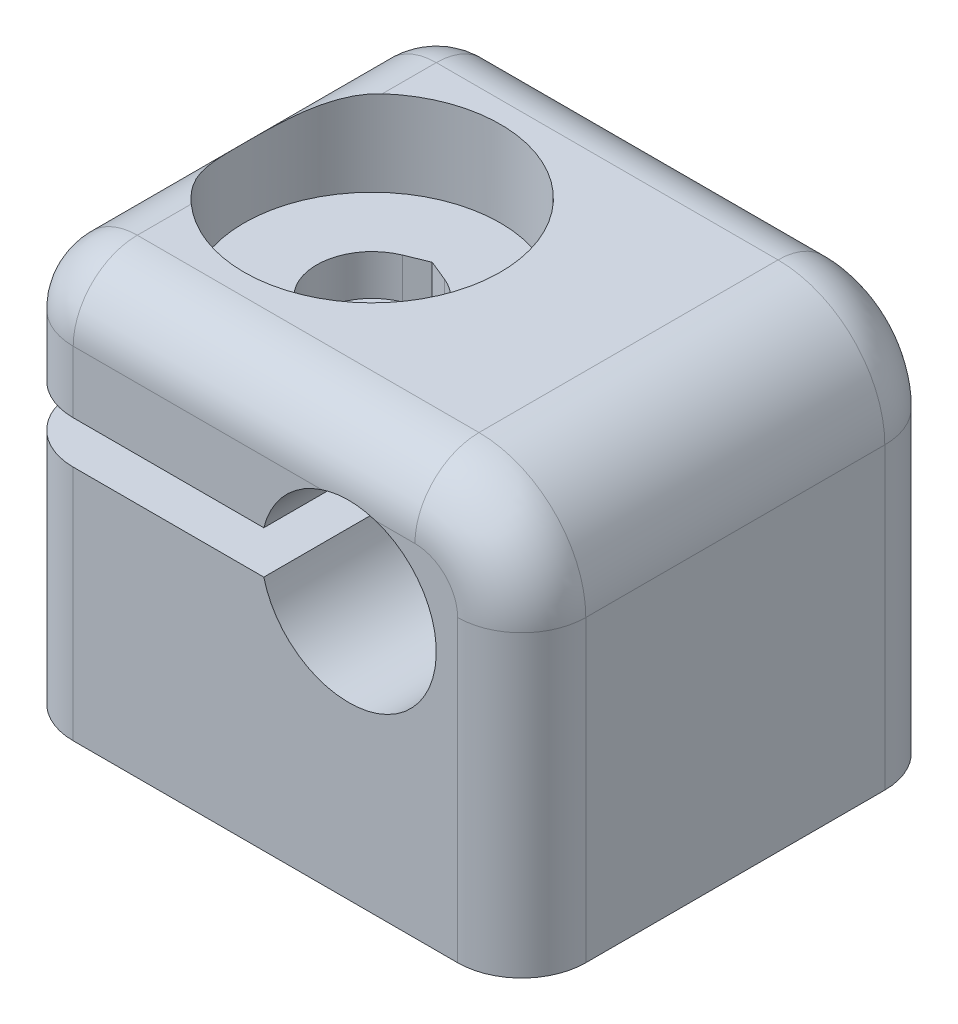
ISO-10303-21;
HEADER;
FILE_DESCRIPTION(('STEP AP214'),'2;1');
FILE_NAME('part.step','',(''),(''),'','','');
FILE_SCHEMA(('AUTOMOTIVE_DESIGN { 1 0 10303 214 1 1 1 1 }'));
ENDSEC;
DATA;
#1=APPLICATION_CONTEXT('core data for automotive mechanical design processes');
#2=APPLICATION_PROTOCOL_DEFINITION('international standard','automotive_design',2000,#1);
#3=PRODUCT_CONTEXT('',#1,'mechanical');
#4=PRODUCT('Part','Part','',(#3));
#5=PRODUCT_RELATED_PRODUCT_CATEGORY('part','',(#4));
#6=PRODUCT_DEFINITION_FORMATION('','',#4);
#7=PRODUCT_DEFINITION_CONTEXT('part definition',#1,'design');
#8=PRODUCT_DEFINITION('design','',#6,#7);
#9=PRODUCT_DEFINITION_SHAPE('','',#8);
#10=(LENGTH_UNIT() NAMED_UNIT(*) SI_UNIT(.MILLI.,.METRE.));
#11=(NAMED_UNIT(*) PLANE_ANGLE_UNIT() SI_UNIT($,.RADIAN.));
#12=(NAMED_UNIT(*) SI_UNIT($,.STERADIAN.) SOLID_ANGLE_UNIT());
#13=UNCERTAINTY_MEASURE_WITH_UNIT(LENGTH_MEASURE(1.E-05),#10,'distance_accuracy_value','');
#14=(GEOMETRIC_REPRESENTATION_CONTEXT(3) GLOBAL_UNCERTAINTY_ASSIGNED_CONTEXT((#13)) GLOBAL_UNIT_ASSIGNED_CONTEXT((#10,
#11,#12)) REPRESENTATION_CONTEXT('',''));
#15=CARTESIAN_POINT('',(0.,0.,0.));
#16=DIRECTION('',(0.,0.,1.));
#17=DIRECTION('',(1.,0.,0.));
#18=AXIS2_PLACEMENT_3D('',#15,#16,#17);
#19=CARTESIAN_POINT('',(7.,0.,10.));
#20=DIRECTION('',(0.,1.,0.));
#21=DIRECTION('',(0.,0.,1.));
#22=AXIS2_PLACEMENT_3D('',#19,#20,#21);
#23=CYLINDRICAL_SURFACE('',#22,2.6);
#24=DIRECTION('',(0.,1.,0.));
#25=VECTOR('',#24,1.);
#26=CARTESIAN_POINT('',(6.01509273831689,0.,7.59376690948614));
#27=LINE('',#26,#25);
#28=CARTESIAN_POINT('',(6.01509273831689,13.1,7.59376690948614));
#29=VERTEX_POINT('',#28);
#30=CARTESIAN_POINT('',(6.01509273831689,15.,7.59376690948614));
#31=VERTEX_POINT('',#30);
#32=EDGE_CURVE('E223',#29,#31,#27,.T.);
#33=ORIENTED_EDGE('',*,*,#32,.T.);
#34=CARTESIAN_POINT('',(7.,15.,10.));
#35=DIRECTION('',(0.,1.,0.));
#36=DIRECTION('',(0.,0.,1.));
#37=AXIS2_PLACEMENT_3D('',#34,#35,#36);
#38=CIRCLE('',#37,2.6);
#39=CARTESIAN_POINT('',(7.98490726168311,15.,7.59376690948614));
#40=VERTEX_POINT('',#39);
#41=EDGE_CURVE('E267',#31,#40,#38,.T.);
#42=ORIENTED_EDGE('',*,*,#41,.T.);
#43=DIRECTION('',(0.,1.,0.));
#44=VECTOR('',#43,1.);
#45=CARTESIAN_POINT('',(7.98490726168311,0.,7.59376690948614));
#46=LINE('',#45,#44);
#47=CARTESIAN_POINT('',(7.98490726168311,13.1,7.59376690948614));
#48=VERTEX_POINT('',#47);
#49=EDGE_CURVE('E67',#48,#40,#46,.T.);
#50=ORIENTED_EDGE('',*,*,#49,.F.);
#51=CARTESIAN_POINT('',(7.,13.1,10.));
#52=DIRECTION('',(0.,1.,0.));
#53=DIRECTION('',(0.,0.,1.));
#54=AXIS2_PLACEMENT_3D('',#51,#52,#53);
#55=CIRCLE('',#54,2.6);
#56=EDGE_CURVE('E282',#29,#48,#55,.T.);
#57=ORIENTED_EDGE('',*,*,#56,.F.);
#58=EDGE_LOOP('',(#33,#42,#50,#57));
#59=FACE_BOUND('',#58,.T.);
#60=ADVANCED_FACE('F41',(#59),#23,.F.);
#61=CARTESIAN_POINT('',(6.01509273831689,0.,7.59376690948614));
#62=VERTEX_POINT('',#61);
#63=CARTESIAN_POINT('',(6.01509273831689,11.1,7.59376690948614));
#64=VERTEX_POINT('',#63);
#65=EDGE_CURVE('E230',#62,#64,#27,.T.);
#66=ORIENTED_EDGE('',*,*,#65,.T.);
#67=CARTESIAN_POINT('',(7.,11.1,10.));
#68=DIRECTION('',(0.,1.,0.));
#69=DIRECTION('',(0.,0.,1.));
#70=AXIS2_PLACEMENT_3D('',#67,#68,#69);
#71=CIRCLE('',#70,2.6);
#72=CARTESIAN_POINT('',(7.98490726168311,11.1,7.59376690948614));
#73=VERTEX_POINT('',#72);
#74=EDGE_CURVE('E283',#64,#73,#71,.T.);
#75=ORIENTED_EDGE('',*,*,#74,.T.);
#76=CARTESIAN_POINT('',(7.98490726168311,0.,7.59376690948614));
#77=VERTEX_POINT('',#76);
#78=EDGE_CURVE('E251',#77,#73,#46,.T.);
#79=ORIENTED_EDGE('',*,*,#78,.F.);
#80=CARTESIAN_POINT('',(7.,0.,10.));
#81=DIRECTION('',(0.,1.,0.));
#82=DIRECTION('',(0.,0.,1.));
#83=AXIS2_PLACEMENT_3D('',#80,#81,#82);
#84=CIRCLE('',#83,2.6);
#85=EDGE_CURVE('E238',#62,#77,#84,.T.);
#86=ORIENTED_EDGE('',*,*,#85,.F.);
#87=EDGE_LOOP('',(#66,#75,#79,#86));
#88=FACE_BOUND('',#87,.T.);
#89=ADVANCED_FACE('F524',(#88),#23,.F.);
#90=CARTESIAN_POINT('',(0.,0.,0.));
#91=DIRECTION('',(0.,0.,1.));
#92=DIRECTION('',(1.,0.,0.));
#93=AXIS2_PLACEMENT_3D('',#90,#91,#92);
#94=PLANE('',#93);
#95=DIRECTION('',(1.,0.,0.));
#96=VECTOR('',#95,1.);
#97=CARTESIAN_POINT('',(0.,13.1,0.));
#98=LINE('',#97,#96);
#99=CARTESIAN_POINT('',(3.,13.1,0.));
#100=VERTEX_POINT('',#99);
#101=CARTESIAN_POINT('',(11.9238209295858,13.1,0.));
#102=VERTEX_POINT('',#101);
#103=EDGE_CURVE('E316',#100,#102,#98,.T.);
#104=ORIENTED_EDGE('',*,*,#103,.F.);
#105=DIRECTION('',(0.,1.,0.));
#106=VECTOR('',#105,1.);
#107=CARTESIAN_POINT('',(3.,19.,0.));
#108=LINE('',#107,#106);
#109=CARTESIAN_POINT('',(3.,16.,0.));
#110=VERTEX_POINT('',#109);
#111=EDGE_CURVE('E410',#100,#110,#108,.T.);
#112=ORIENTED_EDGE('',*,*,#111,.T.);
#113=DIRECTION('',(1.,0.,0.));
#114=VECTOR('',#113,1.);
#115=CARTESIAN_POINT('',(19.,16.,0.));
#116=LINE('',#115,#114);
#117=CARTESIAN_POINT('',(14.6350889359327,16.,0.));
#118=VERTEX_POINT('',#117);
#119=EDGE_CURVE('E407',#110,#118,#116,.T.);
#120=ORIENTED_EDGE('',*,*,#119,.T.);
#121=CARTESIAN_POINT('',(15.9,12.1,0.));
#122=DIRECTION('',(0.,0.,1.));
#123=DIRECTION('',(1.,0.,0.));
#124=AXIS2_PLACEMENT_3D('',#121,#122,#123);
#125=CIRCLE('',#124,4.1);
#126=EDGE_CURVE('E287',#118,#102,#125,.T.);
#127=ORIENTED_EDGE('',*,*,#126,.T.);
#128=EDGE_LOOP('',(#104,#112,#120,#127));
#129=FACE_BOUND('',#128,.T.);
#130=ADVANCED_FACE('F536',(#129),#94,.F.);
#131=CARTESIAN_POINT('',(0.,0.,20.));
#132=DIRECTION('',(0.,0.,1.));
#133=DIRECTION('',(1.,0.,0.));
#134=AXIS2_PLACEMENT_3D('',#131,#132,#133);
#135=PLANE('',#134);
#136=DIRECTION('',(1.,0.,0.));
#137=VECTOR('',#136,1.);
#138=CARTESIAN_POINT('',(0.,11.1,20.));
#139=LINE('',#138,#137);
#140=CARTESIAN_POINT('',(3.,11.1,20.));
#141=VERTEX_POINT('',#140);
#142=CARTESIAN_POINT('',(11.9238209295858,11.1,20.));
#143=VERTEX_POINT('',#142);
#144=EDGE_CURVE('E292',#141,#143,#139,.T.);
#145=ORIENTED_EDGE('',*,*,#144,.F.);
#146=DIRECTION('',(0.,1.,0.));
#147=VECTOR('',#146,1.);
#148=CARTESIAN_POINT('',(3.,0.,20.));
#149=LINE('',#148,#147);
#150=CARTESIAN_POINT('',(3.,0.,20.));
#151=VERTEX_POINT('',#150);
#152=EDGE_CURVE('E370',#141,#151,#149,.F.);
#153=ORIENTED_EDGE('',*,*,#152,.T.);
#154=DIRECTION('',(1.,0.,0.));
#155=VECTOR('',#154,1.);
#156=CARTESIAN_POINT('',(0.,0.,20.));
#157=LINE('',#156,#155);
#158=CARTESIAN_POINT('',(21.,0.,20.));
#159=VERTEX_POINT('',#158);
#160=EDGE_CURVE('E296',#151,#159,#157,.T.);
#161=ORIENTED_EDGE('',*,*,#160,.T.);
#162=DIRECTION('',(0.,1.,0.));
#163=VECTOR('',#162,1.);
#164=CARTESIAN_POINT('',(21.,14.,20.));
#165=LINE('',#164,#163);
#166=CARTESIAN_POINT('',(21.,14.,20.));
#167=VERTEX_POINT('',#166);
#168=EDGE_CURVE('E366',#159,#167,#165,.T.);
#169=ORIENTED_EDGE('',*,*,#168,.T.);
#170=CARTESIAN_POINT('',(19.,14.,20.));
#171=DIRECTION('',(0.,0.,1.));
#172=DIRECTION('',(1.,0.,0.));
#173=AXIS2_PLACEMENT_3D('',#170,#171,#172);
#174=CIRCLE('',#173,2.);
#175=CARTESIAN_POINT('',(19.,16.,20.));
#176=VERTEX_POINT('',#175);
#177=EDGE_CURVE('E363',#167,#176,#174,.T.);
#178=ORIENTED_EDGE('',*,*,#177,.T.);
#179=DIRECTION('',(1.,0.,0.));
#180=VECTOR('',#179,1.);
#181=CARTESIAN_POINT('',(0.,16.,20.));
#182=LINE('',#181,#180);
#183=CARTESIAN_POINT('',(17.1649110640674,16.,20.));
#184=VERTEX_POINT('',#183);
#185=EDGE_CURVE('E360',#176,#184,#182,.F.);
#186=ORIENTED_EDGE('',*,*,#185,.T.);
#187=CARTESIAN_POINT('',(15.9,12.1,20.));
#188=DIRECTION('',(0.,0.,1.));
#189=DIRECTION('',(1.,0.,0.));
#190=AXIS2_PLACEMENT_3D('',#187,#188,#189);
#191=CIRCLE('',#190,4.1);
#192=EDGE_CURVE('E288',#143,#184,#191,.T.);
#193=ORIENTED_EDGE('',*,*,#192,.F.);
#194=EDGE_LOOP('',(#145,#153,#161,#169,#178,#186,#193));
#195=FACE_BOUND('',#194,.T.);
#196=ADVANCED_FACE('F532',(#195),#135,.T.);
#197=CARTESIAN_POINT('',(15.9,12.1,20.));
#198=DIRECTION('',(0.,0.,-1.));
#199=DIRECTION('',(-1.,0.,0.));
#200=AXIS2_PLACEMENT_3D('',#197,#198,#199);
#201=CYLINDRICAL_SURFACE('',#200,4.1);
#202=ORIENTED_EDGE('',*,*,#192,.T.);
#203=CARTESIAN_POINT('',(17.1649110640674,16.,20.));
#204=CARTESIAN_POINT('',(17.1031638951836,16.0200268082445,19.9999968937395));
#205=CARTESIAN_POINT('',(17.0409511802578,16.0385836985973,19.9997999076769));
#206=CARTESIAN_POINT('',(16.9157170485939,16.0727235353958,19.9991675618007));
#207=CARTESIAN_POINT('',(16.8526956427364,16.0883065218094,19.998732205191));
#208=CARTESIAN_POINT('',(16.6626075978802,16.1305424047058,19.9972927029825));
#209=CARTESIAN_POINT('',(16.5345091687764,16.1526848060147,19.9961550862282));
#210=CARTESIAN_POINT('',(16.280470281121,16.1842575048887,19.9943766202452));
#211=CARTESIAN_POINT('',(16.1545720687806,16.1940314443266,19.9937225623678));
#212=CARTESIAN_POINT('',(15.9024737937324,16.2019387495765,19.9931971492077));
#213=CARTESIAN_POINT('',(15.7762738675293,16.2000766430753,19.9933254894865));
#214=CARTESIAN_POINT('',(15.4797321163529,16.1819805998517,19.994500651046));
#215=CARTESIAN_POINT('',(15.3096538552461,16.1608708567261,19.9958578965448));
#216=CARTESIAN_POINT('',(15.0559652346775,16.1131321524609,19.9979059068658));
#217=CARTESIAN_POINT('',(14.9708115893245,16.09427285349,19.9985974536958));
#218=CARTESIAN_POINT('',(14.8018579551513,16.0511617615015,19.9996396847393));
#219=CARTESIAN_POINT('',(14.7180582774393,16.0269087475245,19.9999902916786));
#220=CARTESIAN_POINT('',(14.6350889359327,16.,20.));
#221=B_SPLINE_CURVE_WITH_KNOTS('',3,(#203,#204,#205,#206,#207,#208,#209,#210,#211,#212,#213,
#214,#215,#216,#217,#218,#219,#220),.UNSPECIFIED.,.F.,.F.,(4,2,2,2,2,2,2,2,4),(0.,
0.194701616706055,0.389400616529195,0.778773606233934,1.1570721766778,1.53522355702222,
2.0478643918967,2.30937389821554,2.57094266203364),.UNSPECIFIED.);
#222=CARTESIAN_POINT('',(14.6350889359327,16.,20.));
#223=VERTEX_POINT('',#222);
#224=EDGE_CURVE('E460',#184,#223,#221,.T.);
#225=ORIENTED_EDGE('',*,*,#224,.T.);
#226=CARTESIAN_POINT('',(11.9238209295858,13.1,20.));
#227=VERTEX_POINT('',#226);
#228=EDGE_CURVE('E293',#223,#227,#191,.T.);
#229=ORIENTED_EDGE('',*,*,#228,.T.);
#230=DIRECTION('',(0.,0.,-1.));
#231=VECTOR('',#230,1.);
#232=CARTESIAN_POINT('',(11.9238209295858,13.1,20.));
#233=LINE('',#232,#231);
#234=EDGE_CURVE('E304',#227,#102,#233,.T.);
#235=ORIENTED_EDGE('',*,*,#234,.T.);
#236=ORIENTED_EDGE('',*,*,#126,.F.);
#237=CARTESIAN_POINT('',(14.6350889359327,16.,0.));
#238=CARTESIAN_POINT('',(14.6968361048164,16.0200268082445,3.10626050887969E-06));
#239=CARTESIAN_POINT('',(14.7590488197422,16.0385836985973,0.000200092323089053));
#240=CARTESIAN_POINT('',(14.8842829514061,16.0727235353958,0.000832438199301096));
#241=CARTESIAN_POINT('',(14.9473043572636,16.0883065218094,0.00126779480904008));
#242=CARTESIAN_POINT('',(15.1373924021198,16.1305424047058,0.00270729701751907));
#243=CARTESIAN_POINT('',(15.2654908312236,16.1526848060147,0.00384491377183081));
#244=CARTESIAN_POINT('',(15.519529718879,16.1842575048887,0.00562337975484948));
#245=CARTESIAN_POINT('',(15.6454279312194,16.1940314443266,0.00627743763217685));
#246=CARTESIAN_POINT('',(15.8975262062676,16.2019387495765,0.00680285079230982));
#247=CARTESIAN_POINT('',(16.0237261324707,16.2000766430753,0.00667451051352525));
#248=CARTESIAN_POINT('',(16.3202678836471,16.1819805998517,0.00549934895396518));
#249=CARTESIAN_POINT('',(16.4903461447539,16.1608708567261,0.00414210345523295));
#250=CARTESIAN_POINT('',(16.7440347653225,16.1131321524609,0.00209409313415694));
#251=CARTESIAN_POINT('',(16.8291884106755,16.09427285349,0.00140254630419275));
#252=CARTESIAN_POINT('',(16.9981420448487,16.0511617615015,0.000360315260662845));
#253=CARTESIAN_POINT('',(17.0819417225608,16.0269087475245,9.70832135134175E-06));
#254=CARTESIAN_POINT('',(17.1649110640674,16.,0.));
#255=B_SPLINE_CURVE_WITH_KNOTS('',3,(#237,#238,#239,#240,#241,#242,#243,#244,#245,#246,#247,
#248,#249,#250,#251,#252,#253,#254),.UNSPECIFIED.,.F.,.F.,(4,2,2,2,2,2,2,2,4),(0.,
0.194701616706055,0.389400616529195,0.778773606233936,1.1570721766778,1.53522355702222,
2.0478643918967,2.30937389821554,2.57094266203364),.UNSPECIFIED.);
#256=CARTESIAN_POINT('',(17.1649110640674,16.,0.));
#257=VERTEX_POINT('',#256);
#258=EDGE_CURVE('E451',#118,#257,#255,.T.);
#259=ORIENTED_EDGE('',*,*,#258,.T.);
#260=CARTESIAN_POINT('',(11.9238209295858,11.1,0.));
#261=VERTEX_POINT('',#260);
#262=EDGE_CURVE('E305',#261,#257,#125,.T.);
#263=ORIENTED_EDGE('',*,*,#262,.F.);
#264=DIRECTION('',(0.,0.,-1.));
#265=VECTOR('',#264,1.);
#266=CARTESIAN_POINT('',(11.9238209295858,11.1,20.));
#267=LINE('',#266,#265);
#268=EDGE_CURVE('E338',#143,#261,#267,.T.);
#269=ORIENTED_EDGE('',*,*,#268,.F.);
#270=EDGE_LOOP('',(#202,#225,#229,#235,#236,#259,#263,#269));
#271=FACE_BOUND('',#270,.T.);
#272=ADVANCED_FACE('F467',(#271),#201,.F.);
#273=CARTESIAN_POINT('',(0.,11.1,20.));
#274=DIRECTION('',(0.,1.,0.));
#275=DIRECTION('',(0.,0.,1.));
#276=AXIS2_PLACEMENT_3D('',#273,#274,#275);
#277=PLANE('',#276);
#278=DIRECTION('',(-0.925474265582254,0.,0.378810485262734));
#279=VECTOR('',#278,1.);
#280=CARTESIAN_POINT('',(-3.48621913190205,11.1,11.4827962364397));
#281=LINE('',#280,#279);
#282=CARTESIAN_POINT('',(7.,11.1,7.19062960830765));
#283=VERTEX_POINT('',#282);
#284=EDGE_CURVE('E263',#283,#64,#281,.T.);
#285=ORIENTED_EDGE('',*,*,#284,.F.);
#286=DIRECTION('',(-0.925474265582254,0.,-0.378810485262733));
#287=VECTOR('',#286,1.);
#288=CARTESIAN_POINT('',(5.49518250433187,11.1,6.57468525743231));
#289=LINE('',#288,#287);
#290=EDGE_CURVE('E219',#73,#283,#289,.T.);
#291=ORIENTED_EDGE('',*,*,#290,.F.);
#292=ORIENTED_EDGE('',*,*,#74,.F.);
#293=EDGE_LOOP('',(#285,#291,#292));
#294=FACE_BOUND('',#293,.T.);
#295=DIRECTION('',(0.,0.,-1.));
#296=VECTOR('',#295,1.);
#297=CARTESIAN_POINT('',(0.,11.1,20.));
#298=LINE('',#297,#296);
#299=CARTESIAN_POINT('',(0.,11.1,17.));
#300=VERTEX_POINT('',#299);
#301=CARTESIAN_POINT('',(0.,11.1,3.));
#302=VERTEX_POINT('',#301);
#303=EDGE_CURVE('E334',#300,#302,#298,.T.);
#304=ORIENTED_EDGE('',*,*,#303,.F.);
#305=CARTESIAN_POINT('',(3.,11.1,17.));
#306=DIRECTION('',(0.,1.,0.));
#307=DIRECTION('',(0.,0.,1.));
#308=AXIS2_PLACEMENT_3D('',#305,#306,#307);
#309=CIRCLE('',#308,3.);
#310=EDGE_CURVE('E428',#300,#141,#309,.T.);
#311=ORIENTED_EDGE('',*,*,#310,.T.);
#312=ORIENTED_EDGE('',*,*,#144,.T.);
#313=ORIENTED_EDGE('',*,*,#268,.T.);
#314=DIRECTION('',(1.,0.,0.));
#315=VECTOR('',#314,1.);
#316=CARTESIAN_POINT('',(0.,11.1,0.));
#317=LINE('',#316,#315);
#318=CARTESIAN_POINT('',(3.,11.1,0.));
#319=VERTEX_POINT('',#318);
#320=EDGE_CURVE('E309',#319,#261,#317,.T.);
#321=ORIENTED_EDGE('',*,*,#320,.F.);
#322=CARTESIAN_POINT('',(3.,11.1,3.));
#323=DIRECTION('',(0.,1.,0.));
#324=DIRECTION('',(0.,0.,1.));
#325=AXIS2_PLACEMENT_3D('',#322,#323,#324);
#326=CIRCLE('',#325,3.);
#327=EDGE_CURVE('E425',#319,#302,#326,.T.);
#328=ORIENTED_EDGE('',*,*,#327,.T.);
#329=EDGE_LOOP('',(#304,#311,#312,#313,#321,#328));
#330=FACE_BOUND('',#329,.T.);
#331=ADVANCED_FACE('F554',(#294,#330),#277,.T.);
#332=CARTESIAN_POINT('',(0.,0.,20.));
#333=DIRECTION('',(-1.,0.,0.));
#334=DIRECTION('',(0.,0.,1.));
#335=AXIS2_PLACEMENT_3D('',#332,#333,#334);
#336=PLANE('',#335);
#337=DIRECTION('',(0.,0.,-1.));
#338=VECTOR('',#337,1.);
#339=CARTESIAN_POINT('',(0.,0.,20.));
#340=LINE('',#339,#338);
#341=CARTESIAN_POINT('',(0.,0.,17.));
#342=VERTEX_POINT('',#341);
#343=CARTESIAN_POINT('',(0.,0.,3.));
#344=VERTEX_POINT('',#343);
#345=EDGE_CURVE('E330',#342,#344,#340,.T.);
#346=ORIENTED_EDGE('',*,*,#345,.F.);
#347=DIRECTION('',(0.,1.,0.));
#348=VECTOR('',#347,1.);
#349=CARTESIAN_POINT('',(0.,0.,17.));
#350=LINE('',#349,#348);
#351=EDGE_CURVE('E421',#342,#300,#350,.T.);
#352=ORIENTED_EDGE('',*,*,#351,.T.);
#353=ORIENTED_EDGE('',*,*,#303,.T.);
#354=DIRECTION('',(0.,1.,0.));
#355=VECTOR('',#354,1.);
#356=CARTESIAN_POINT('',(0.,0.,3.));
#357=LINE('',#356,#355);
#358=EDGE_CURVE('E418',#302,#344,#357,.F.);
#359=ORIENTED_EDGE('',*,*,#358,.T.);
#360=EDGE_LOOP('',(#346,#352,#353,#359));
#361=FACE_BOUND('',#360,.T.);
#362=ADVANCED_FACE('F545',(#361),#336,.T.);
#363=CARTESIAN_POINT('',(0.,0.,20.));
#364=DIRECTION('',(0.,1.,0.));
#365=DIRECTION('',(0.,0.,1.));
#366=AXIS2_PLACEMENT_3D('',#363,#364,#365);
#367=PLANE('',#366);
#368=DIRECTION('',(-0.925474265582254,0.,-0.378810485262733));
#369=VECTOR('',#368,1.);
#370=CARTESIAN_POINT('',(7.98490726168311,0.,7.59376690948614));
#371=LINE('',#370,#369);
#372=CARTESIAN_POINT('',(7.,0.,7.19062960830765));
#373=VERTEX_POINT('',#372);
#374=EDGE_CURVE('E59',#77,#373,#371,.T.);
#375=ORIENTED_EDGE('',*,*,#374,.T.);
#376=DIRECTION('',(-0.925474265582254,0.,0.378810485262734));
#377=VECTOR('',#376,1.);
#378=CARTESIAN_POINT('',(7.,0.,7.19062960830765));
#379=LINE('',#378,#377);
#380=EDGE_CURVE('E227',#373,#62,#379,.T.);
#381=ORIENTED_EDGE('',*,*,#380,.T.);
#382=ORIENTED_EDGE('',*,*,#85,.T.);
#383=EDGE_LOOP('',(#375,#381,#382));
#384=FACE_BOUND('',#383,.T.);
#385=DIRECTION('',(0.,0.,-1.));
#386=VECTOR('',#385,1.);
#387=CARTESIAN_POINT('',(24.,0.,20.));
#388=LINE('',#387,#386);
#389=CARTESIAN_POINT('',(24.,0.,17.));
#390=VERTEX_POINT('',#389);
#391=CARTESIAN_POINT('',(24.,0.,3.));
#392=VERTEX_POINT('',#391);
#393=EDGE_CURVE('E326',#390,#392,#388,.T.);
#394=ORIENTED_EDGE('',*,*,#393,.F.);
#395=CARTESIAN_POINT('',(21.,0.,17.));
#396=DIRECTION('',(0.,1.,0.));
#397=DIRECTION('',(0.,0.,1.));
#398=AXIS2_PLACEMENT_3D('',#395,#396,#397);
#399=CIRCLE('',#398,3.);
#400=EDGE_CURVE('E389',#390,#159,#399,.F.);
#401=ORIENTED_EDGE('',*,*,#400,.T.);
#402=ORIENTED_EDGE('',*,*,#160,.F.);
#403=CARTESIAN_POINT('',(3.,0.,17.));
#404=DIRECTION('',(0.,1.,0.));
#405=DIRECTION('',(0.,0.,1.));
#406=AXIS2_PLACEMENT_3D('',#403,#404,#405);
#407=CIRCLE('',#406,3.);
#408=EDGE_CURVE('E383',#151,#342,#407,.F.);
#409=ORIENTED_EDGE('',*,*,#408,.T.);
#410=ORIENTED_EDGE('',*,*,#345,.T.);
#411=CARTESIAN_POINT('',(3.,0.,3.));
#412=DIRECTION('',(0.,1.,0.));
#413=DIRECTION('',(0.,0.,1.));
#414=AXIS2_PLACEMENT_3D('',#411,#412,#413);
#415=CIRCLE('',#414,3.);
#416=CARTESIAN_POINT('',(3.,0.,0.));
#417=VERTEX_POINT('',#416);
#418=EDGE_CURVE('E380',#344,#417,#415,.F.);
#419=ORIENTED_EDGE('',*,*,#418,.T.);
#420=DIRECTION('',(1.,0.,0.));
#421=VECTOR('',#420,1.);
#422=CARTESIAN_POINT('',(0.,0.,0.));
#423=LINE('',#422,#421);
#424=CARTESIAN_POINT('',(21.,0.,0.));
#425=VERTEX_POINT('',#424);
#426=EDGE_CURVE('E312',#417,#425,#423,.T.);
#427=ORIENTED_EDGE('',*,*,#426,.T.);
#428=CARTESIAN_POINT('',(21.,0.,3.));
#429=DIRECTION('',(0.,1.,0.));
#430=DIRECTION('',(0.,0.,1.));
#431=AXIS2_PLACEMENT_3D('',#428,#429,#430);
#432=CIRCLE('',#431,3.);
#433=EDGE_CURVE('E386',#425,#392,#432,.F.);
#434=ORIENTED_EDGE('',*,*,#433,.T.);
#435=EDGE_LOOP('',(#394,#401,#402,#409,#410,#419,#427,#434));
#436=FACE_BOUND('',#435,.T.);
#437=ADVANCED_FACE('F236',(#384,#436),#367,.F.);
#438=CARTESIAN_POINT('',(24.,0.,20.));
#439=DIRECTION('',(-1.,0.,0.));
#440=DIRECTION('',(0.,0.,1.));
#441=AXIS2_PLACEMENT_3D('',#438,#439,#440);
#442=PLANE('',#441);
#443=DIRECTION('',(0.,0.,-1.));
#444=VECTOR('',#443,1.);
#445=CARTESIAN_POINT('',(24.,14.,20.));
#446=LINE('',#445,#444);
#447=CARTESIAN_POINT('',(24.,14.,3.));
#448=VERTEX_POINT('',#447);
#449=CARTESIAN_POINT('',(24.,14.,17.));
#450=VERTEX_POINT('',#449);
#451=EDGE_CURVE('E346',#448,#450,#446,.F.);
#452=ORIENTED_EDGE('',*,*,#451,.T.);
#453=DIRECTION('',(0.,1.,0.));
#454=VECTOR('',#453,1.);
#455=CARTESIAN_POINT('',(24.,0.,17.));
#456=LINE('',#455,#454);
#457=EDGE_CURVE('E377',#450,#390,#456,.F.);
#458=ORIENTED_EDGE('',*,*,#457,.T.);
#459=ORIENTED_EDGE('',*,*,#393,.T.);
#460=DIRECTION('',(0.,1.,0.));
#461=VECTOR('',#460,1.);
#462=CARTESIAN_POINT('',(24.,0.,3.));
#463=LINE('',#462,#461);
#464=EDGE_CURVE('E373',#392,#448,#463,.T.);
#465=ORIENTED_EDGE('',*,*,#464,.T.);
#466=EDGE_LOOP('',(#452,#458,#459,#465));
#467=FACE_BOUND('',#466,.T.);
#468=ADVANCED_FACE('F548',(#467),#442,.F.);
#469=CARTESIAN_POINT('',(0.,19.,20.));
#470=DIRECTION('',(0.,1.,0.));
#471=DIRECTION('',(0.,0.,1.));
#472=AXIS2_PLACEMENT_3D('',#469,#470,#471);
#473=PLANE('',#472);
#474=DIRECTION('',(1.,0.,0.));
#475=VECTOR('',#474,1.);
#476=CARTESIAN_POINT('',(0.,19.,3.));
#477=LINE('',#476,#475);
#478=CARTESIAN_POINT('',(19.,19.,3.));
#479=VERTEX_POINT('',#478);
#480=CARTESIAN_POINT('',(3.,19.,3.));
#481=VERTEX_POINT('',#480);
#482=EDGE_CURVE('E444',#479,#481,#477,.F.);
#483=ORIENTED_EDGE('',*,*,#482,.T.);
#484=DIRECTION('',(0.,0.,-1.));
#485=VECTOR('',#484,1.);
#486=CARTESIAN_POINT('',(3.,19.,20.));
#487=LINE('',#486,#485);
#488=CARTESIAN_POINT('',(3.,19.,5.52786404500042));
#489=VERTEX_POINT('',#488);
#490=EDGE_CURVE('E511',#481,#489,#487,.F.);
#491=ORIENTED_EDGE('',*,*,#490,.T.);
#492=CARTESIAN_POINT('',(7.,19.,10.));
#493=DIRECTION('',(0.,1.,0.));
#494=DIRECTION('',(0.,0.,1.));
#495=AXIS2_PLACEMENT_3D('',#492,#493,#494);
#496=CIRCLE('',#495,6.);
#497=CARTESIAN_POINT('',(3.,19.,14.4721359549996));
#498=VERTEX_POINT('',#497);
#499=EDGE_CURVE('E271',#498,#489,#496,.T.);
#500=ORIENTED_EDGE('',*,*,#499,.F.);
#501=DIRECTION('',(0.,0.,-1.));
#502=VECTOR('',#501,1.);
#503=CARTESIAN_POINT('',(3.,19.,20.));
#504=LINE('',#503,#502);
#505=CARTESIAN_POINT('',(3.,19.,17.));
#506=VERTEX_POINT('',#505);
#507=EDGE_CURVE('E604',#498,#506,#504,.F.);
#508=ORIENTED_EDGE('',*,*,#507,.T.);
#509=DIRECTION('',(1.,0.,0.));
#510=VECTOR('',#509,1.);
#511=CARTESIAN_POINT('',(0.,19.,17.));
#512=LINE('',#511,#510);
#513=CARTESIAN_POINT('',(19.,19.,17.));
#514=VERTEX_POINT('',#513);
#515=EDGE_CURVE('E448',#506,#514,#512,.T.);
#516=ORIENTED_EDGE('',*,*,#515,.T.);
#517=DIRECTION('',(0.,0.,-1.));
#518=VECTOR('',#517,1.);
#519=CARTESIAN_POINT('',(19.,19.,0.));
#520=LINE('',#519,#518);
#521=EDGE_CURVE('E342',#514,#479,#520,.T.);
#522=ORIENTED_EDGE('',*,*,#521,.T.);
#523=EDGE_LOOP('',(#483,#491,#500,#508,#516,#522));
#524=FACE_BOUND('',#523,.T.);
#525=ADVANCED_FACE('F543',(#524),#473,.T.);
#526=DIRECTION('',(0.,1.,0.));
#527=VECTOR('',#526,1.);
#528=CARTESIAN_POINT('',(0.,0.,17.));
#529=LINE('',#528,#527);
#530=CARTESIAN_POINT('',(0.,13.1,17.));
#531=VERTEX_POINT('',#530);
#532=CARTESIAN_POINT('',(0.,16.,17.));
#533=VERTEX_POINT('',#532);
#534=EDGE_CURVE('E431',#531,#533,#529,.T.);
#535=ORIENTED_EDGE('',*,*,#534,.T.);
#536=DIRECTION('',(0.,0.,-1.));
#537=VECTOR('',#536,1.);
#538=CARTESIAN_POINT('',(0.,16.,20.));
#539=LINE('',#538,#537);
#540=CARTESIAN_POINT('',(0.,16.,3.));
#541=VERTEX_POINT('',#540);
#542=EDGE_CURVE('E602',#533,#541,#539,.T.);
#543=ORIENTED_EDGE('',*,*,#542,.T.);
#544=DIRECTION('',(0.,1.,0.));
#545=VECTOR('',#544,1.);
#546=CARTESIAN_POINT('',(0.,13.1,3.));
#547=LINE('',#546,#545);
#548=CARTESIAN_POINT('',(0.,13.1,3.));
#549=VERTEX_POINT('',#548);
#550=EDGE_CURVE('E435',#541,#549,#547,.F.);
#551=ORIENTED_EDGE('',*,*,#550,.T.);
#552=DIRECTION('',(0.,0.,-1.));
#553=VECTOR('',#552,1.);
#554=CARTESIAN_POINT('',(0.,13.1,20.));
#555=LINE('',#554,#553);
#556=EDGE_CURVE('E322',#531,#549,#555,.T.);
#557=ORIENTED_EDGE('',*,*,#556,.F.);
#558=EDGE_LOOP('',(#535,#543,#551,#557));
#559=FACE_BOUND('',#558,.T.);
#560=ADVANCED_FACE('F539',(#559),#336,.T.);
#561=CARTESIAN_POINT('',(0.,13.1,20.));
#562=DIRECTION('',(0.,1.,0.));
#563=DIRECTION('',(0.,0.,1.));
#564=AXIS2_PLACEMENT_3D('',#561,#562,#563);
#565=PLANE('',#564);
#566=DIRECTION('',(-0.925474265582254,0.,-0.378810485262733));
#567=VECTOR('',#566,1.);
#568=CARTESIAN_POINT('',(5.49518250433187,13.1,6.57468525743231));
#569=LINE('',#568,#567);
#570=CARTESIAN_POINT('',(7.,13.1,7.19062960830765));
#571=VERTEX_POINT('',#570);
#572=EDGE_CURVE('E249',#48,#571,#569,.T.);
#573=ORIENTED_EDGE('',*,*,#572,.T.);
#574=DIRECTION('',(-0.925474265582254,0.,0.378810485262734));
#575=VECTOR('',#574,1.);
#576=CARTESIAN_POINT('',(-3.48621913190205,13.1,11.4827962364397));
#577=LINE('',#576,#575);
#578=EDGE_CURVE('E259',#571,#29,#577,.T.);
#579=ORIENTED_EDGE('',*,*,#578,.T.);
#580=ORIENTED_EDGE('',*,*,#56,.T.);
#581=EDGE_LOOP('',(#573,#579,#580));
#582=FACE_BOUND('',#581,.T.);
#583=ORIENTED_EDGE('',*,*,#556,.T.);
#584=CARTESIAN_POINT('',(3.,13.1,3.));
#585=DIRECTION('',(0.,1.,0.));
#586=DIRECTION('',(0.,0.,1.));
#587=AXIS2_PLACEMENT_3D('',#584,#585,#586);
#588=CIRCLE('',#587,3.);
#589=EDGE_CURVE('E441',#549,#100,#588,.F.);
#590=ORIENTED_EDGE('',*,*,#589,.T.);
#591=ORIENTED_EDGE('',*,*,#103,.T.);
#592=ORIENTED_EDGE('',*,*,#234,.F.);
#593=DIRECTION('',(1.,0.,0.));
#594=VECTOR('',#593,1.);
#595=CARTESIAN_POINT('',(0.,13.1,20.));
#596=LINE('',#595,#594);
#597=CARTESIAN_POINT('',(3.,13.1,20.));
#598=VERTEX_POINT('',#597);
#599=EDGE_CURVE('E300',#598,#227,#596,.T.);
#600=ORIENTED_EDGE('',*,*,#599,.F.);
#601=CARTESIAN_POINT('',(3.,13.1,17.));
#602=DIRECTION('',(0.,1.,0.));
#603=DIRECTION('',(0.,0.,1.));
#604=AXIS2_PLACEMENT_3D('',#601,#602,#603);
#605=CIRCLE('',#604,3.);
#606=EDGE_CURVE('E438',#598,#531,#605,.F.);
#607=ORIENTED_EDGE('',*,*,#606,.T.);
#608=EDGE_LOOP('',(#583,#590,#591,#592,#600,#607));
#609=FACE_BOUND('',#608,.T.);
#610=ADVANCED_FACE('F530',(#582,#609),#565,.F.);
#611=DIRECTION('',(1.,0.,0.));
#612=VECTOR('',#611,1.);
#613=CARTESIAN_POINT('',(0.,16.,20.));
#614=LINE('',#613,#612);
#615=CARTESIAN_POINT('',(3.,16.,20.));
#616=VERTEX_POINT('',#615);
#617=EDGE_CURVE('E350',#223,#616,#614,.F.);
#618=ORIENTED_EDGE('',*,*,#617,.T.);
#619=DIRECTION('',(0.,1.,0.));
#620=VECTOR('',#619,1.);
#621=CARTESIAN_POINT('',(3.,0.,20.));
#622=LINE('',#621,#620);
#623=EDGE_CURVE('E357',#616,#598,#622,.F.);
#624=ORIENTED_EDGE('',*,*,#623,.T.);
#625=ORIENTED_EDGE('',*,*,#599,.T.);
#626=ORIENTED_EDGE('',*,*,#228,.F.);
#627=EDGE_LOOP('',(#618,#624,#625,#626));
#628=FACE_BOUND('',#627,.T.);
#629=ADVANCED_FACE('F526',(#628),#135,.T.);
#630=ORIENTED_EDGE('',*,*,#426,.F.);
#631=DIRECTION('',(0.,1.,0.));
#632=VECTOR('',#631,1.);
#633=CARTESIAN_POINT('',(3.,11.1,0.));
#634=LINE('',#633,#632);
#635=EDGE_CURVE('E414',#417,#319,#634,.T.);
#636=ORIENTED_EDGE('',*,*,#635,.T.);
#637=ORIENTED_EDGE('',*,*,#320,.T.);
#638=ORIENTED_EDGE('',*,*,#262,.T.);
#639=DIRECTION('',(1.,0.,0.));
#640=VECTOR('',#639,1.);
#641=CARTESIAN_POINT('',(19.,16.,0.));
#642=LINE('',#641,#640);
#643=CARTESIAN_POINT('',(19.,16.,0.));
#644=VERTEX_POINT('',#643);
#645=EDGE_CURVE('E398',#257,#644,#642,.T.);
#646=ORIENTED_EDGE('',*,*,#645,.T.);
#647=CARTESIAN_POINT('',(19.,14.,0.));
#648=DIRECTION('',(0.,0.,1.));
#649=DIRECTION('',(1.,0.,0.));
#650=AXIS2_PLACEMENT_3D('',#647,#648,#649);
#651=CIRCLE('',#650,2.);
#652=CARTESIAN_POINT('',(21.,14.,0.));
#653=VERTEX_POINT('',#652);
#654=EDGE_CURVE('E401',#644,#653,#651,.F.);
#655=ORIENTED_EDGE('',*,*,#654,.T.);
#656=DIRECTION('',(0.,1.,0.));
#657=VECTOR('',#656,1.);
#658=CARTESIAN_POINT('',(21.,0.,0.));
#659=LINE('',#658,#657);
#660=EDGE_CURVE('E404',#653,#425,#659,.F.);
#661=ORIENTED_EDGE('',*,*,#660,.T.);
#662=EDGE_LOOP('',(#630,#636,#637,#638,#646,#655,#661));
#663=FACE_BOUND('',#662,.T.);
#664=ADVANCED_FACE('F529',(#663),#94,.F.);
#665=CARTESIAN_POINT('',(19.,14.,20.));
#666=DIRECTION('',(0.,0.,1.));
#667=DIRECTION('',(1.,0.,0.));
#668=AXIS2_PLACEMENT_3D('',#665,#666,#667);
#669=CYLINDRICAL_SURFACE('',#668,5.);
#670=ORIENTED_EDGE('',*,*,#521,.F.);
#671=CARTESIAN_POINT('',(19.,14.,17.));
#672=DIRECTION('',(0.,0.,1.));
#673=DIRECTION('',(1.,0.,0.));
#674=AXIS2_PLACEMENT_3D('',#671,#672,#673);
#675=CIRCLE('',#674,5.);
#676=EDGE_CURVE('E395',#514,#450,#675,.F.);
#677=ORIENTED_EDGE('',*,*,#676,.T.);
#678=ORIENTED_EDGE('',*,*,#451,.F.);
#679=CARTESIAN_POINT('',(19.,14.,3.));
#680=DIRECTION('',(0.,0.,1.));
#681=DIRECTION('',(1.,0.,0.));
#682=AXIS2_PLACEMENT_3D('',#679,#680,#681);
#683=CIRCLE('',#682,5.);
#684=EDGE_CURVE('E392',#448,#479,#683,.T.);
#685=ORIENTED_EDGE('',*,*,#684,.T.);
#686=EDGE_LOOP('',(#670,#677,#678,#685));
#687=FACE_BOUND('',#686,.T.);
#688=ADVANCED_FACE('F519',(#687),#669,.T.);
#689=CARTESIAN_POINT('',(7.,15.,10.));
#690=DIRECTION('',(0.,1.,0.));
#691=DIRECTION('',(0.,0.,1.));
#692=AXIS2_PLACEMENT_3D('',#689,#690,#691);
#693=CYLINDRICAL_SURFACE('',#692,6.);
#694=CARTESIAN_POINT('',(7.,15.,10.));
#695=DIRECTION('',(0.,1.,0.));
#696=DIRECTION('',(0.,0.,1.));
#697=AXIS2_PLACEMENT_3D('',#694,#695,#696);
#698=CIRCLE('',#697,6.);
#699=CARTESIAN_POINT('',(7.,15.,16.));
#700=VERTEX_POINT('',#699);
#701=EDGE_CURVE('E273',#700,#700,#698,.T.);
#702=ORIENTED_EDGE('',*,*,#701,.F.);
#703=EDGE_LOOP('',(#702));
#704=FACE_BOUND('',#703,.T.);
#705=ORIENTED_EDGE('',*,*,#499,.T.);
#706=CARTESIAN_POINT('',(3.,19.,5.52786404500042));
#707=CARTESIAN_POINT('',(2.90471365181576,18.9999884983028,5.61306525608464));
#708=CARTESIAN_POINT('',(2.81225404281387,18.9954631120197,5.70126779003478));
#709=CARTESIAN_POINT('',(2.63360646625974,18.9788928708196,5.88287231137559));
#710=CARTESIAN_POINT('',(2.54740809420755,18.9668608246223,5.97626519563424));
#711=CARTESIAN_POINT('',(2.38196155459082,18.9368457073964,6.16729380652265));
#712=CARTESIAN_POINT('',(2.30268276367389,18.9188907352452,6.26490764415887));
#713=CARTESIAN_POINT('',(2.15079186243182,18.8783723494553,6.46433907379339));
#714=CARTESIAN_POINT('',(2.07818347864384,18.8558063822291,6.5661589700869));
#715=CARTESIAN_POINT('',(1.91390974560992,18.7983125937665,6.81236254583668));
#716=CARTESIAN_POINT('',(1.82526867857052,18.7619172893164,6.9584272874758));
#717=CARTESIAN_POINT('',(1.66100582783213,18.6861267768259,7.25697451953005));
#718=CARTESIAN_POINT('',(1.58538800261173,18.6467306619037,7.40945894377464));
#719=CARTESIAN_POINT('',(1.44717801597278,18.5680881829873,7.72069588248119));
#720=CARTESIAN_POINT('',(1.38461569299406,18.5288423589984,7.87946178992956));
#721=CARTESIAN_POINT('',(1.27303318887318,18.4539970929463,8.20249391140237));
#722=CARTESIAN_POINT('',(1.22400796142786,18.4183962952275,8.36675805014619));
#723=CARTESIAN_POINT('',(1.14974697916958,18.3618230449543,8.66136878332832));
#724=CARTESIAN_POINT('',(1.12162995969205,18.3393746074743,8.79070723014206));
#725=CARTESIAN_POINT('',(1.07391324706374,18.3002491400309,9.05179425935981));
#726=CARTESIAN_POINT('',(1.05431094548803,18.2835703428972,9.18354209075879));
#727=CARTESIAN_POINT('',(1.02394167999927,18.2573433868963,9.4482693909018));
#728=CARTESIAN_POINT('',(1.01314191521176,18.2477687678225,9.58124240259946));
#729=CARTESIAN_POINT('',(1.00044155816295,18.2364795834717,9.84795215729149));
#730=CARTESIAN_POINT('',(0.998540696558501,18.2347647803018,9.98168887704804));
#731=CARTESIAN_POINT('',(1.00367627495911,18.239353105404,10.2489676155701));
#732=CARTESIAN_POINT('',(1.01072067420721,18.2456633741684,10.3825093549475));
#733=CARTESIAN_POINT('',(1.03363131944154,18.2657498048065,10.6482577133817));
#734=CARTESIAN_POINT('',(1.04949811845991,18.2795264347077,10.7804642482122));
#735=CARTESIAN_POINT('',(1.08989467385797,18.3134804189546,11.0432673665608));
#736=CARTESIAN_POINT('',(1.11446031616621,18.3336842522472,11.1738549257917));
#737=CARTESIAN_POINT('',(1.17196367705255,18.3789957967963,11.4323179658177));
#738=CARTESIAN_POINT('',(1.2049039918543,18.4041050282102,11.5601925922358));
#739=CARTESIAN_POINT('',(1.29025885920174,18.4658343422954,11.8516025797074));
#740=CARTESIAN_POINT('',(1.3455477992725,18.5036237965007,12.014056373431));
#741=CARTESIAN_POINT('',(1.46957129400838,18.5813082211106,12.3331771305788));
#742=CARTESIAN_POINT('',(1.53831097913271,18.6212039906647,12.4898418587125));
#743=CARTESIAN_POINT('',(1.76393257577933,18.7387582421131,12.9495234290865));
#744=CARTESIAN_POINT('',(1.94066870803203,18.8146700442187,13.2437628636355));
#745=CARTESIAN_POINT('',(2.26699322879898,18.9119508164745,13.6936701019399));
#746=CARTESIAN_POINT('',(2.40061108505724,18.9430583542217,13.8588913937908));
#747=CARTESIAN_POINT('',(2.61498728036572,18.9760742385095,14.096721427449));
#748=CARTESIAN_POINT('',(2.68896358819514,18.9848096888099,14.1745040934581));
#749=CARTESIAN_POINT('',(2.84129042428804,18.996773605905,14.326284281032));
#750=CARTESIAN_POINT('',(2.91964606454823,18.9999954919652,14.4002771773143));
#751=CARTESIAN_POINT('',(3.,19.,14.4721359549996));
#752=B_SPLINE_CURVE_WITH_KNOTS('',3,(#706,#707,#708,#709,#710,#711,#712,#713,#714,#715,#716,
#717,#718,#719,#720,#721,#722,#723,#724,#725,#726,#727,#728,#729,#730,#731,#732,#733,#734,#735,
#736,#737,#738,#739,#740,#741,#742,#743,#744,#745,#746,#747,#748,#749,#750,#751),.UNSPECIFIED.,
.F.,.F.,(4,2,2,2,2,2,2,2,2,2,2,2,2,2,2,2,2,2,2,2,2,2,4),(0.,0.383171061972278,0.765690095213907,
1.14641991400536,1.52736115675284,2.05072488899296,2.57424742053796,3.09895366967931,
3.62346405609252,4.02584724528558,4.42810708008792,4.82886103248958,5.2296028551903,
5.63070149673649,6.03182528398688,6.4346235114692,6.83754676260618,7.36395422366978,
7.89056286280961,8.9388959465241,9.58145610417012,9.90427531068803,10.2274795511922),.UNSPECIFIED.);
#753=EDGE_CURVE('E502',#489,#498,#752,.T.);
#754=ORIENTED_EDGE('',*,*,#753,.T.);
#755=EDGE_LOOP('',(#705,#754));
#756=FACE_BOUND('',#755,.T.);
#757=ADVANCED_FACE('F513',(#704,#756),#693,.F.);
#758=CARTESIAN_POINT('',(7.,15.,10.));
#759=DIRECTION('',(0.,1.,0.));
#760=DIRECTION('',(0.,0.,1.));
#761=AXIS2_PLACEMENT_3D('',#758,#759,#760);
#762=PLANE('',#761);
#763=DIRECTION('',(-0.925474265582254,0.,0.378810485262734));
#764=VECTOR('',#763,1.);
#765=CARTESIAN_POINT('',(7.,15.,7.19062960830765));
#766=LINE('',#765,#764);
#767=CARTESIAN_POINT('',(7.,15.,7.19062960830765));
#768=VERTEX_POINT('',#767);
#769=EDGE_CURVE('E240',#768,#31,#766,.T.);
#770=ORIENTED_EDGE('',*,*,#769,.F.);
#771=DIRECTION('',(-0.925474265582254,0.,-0.378810485262733));
#772=VECTOR('',#771,1.);
#773=CARTESIAN_POINT('',(7.98490726168311,15.,7.59376690948614));
#774=LINE('',#773,#772);
#775=EDGE_CURVE('E243',#40,#768,#774,.T.);
#776=ORIENTED_EDGE('',*,*,#775,.F.);
#777=ORIENTED_EDGE('',*,*,#41,.F.);
#778=EDGE_LOOP('',(#770,#776,#777));
#779=FACE_BOUND('',#778,.T.);
#780=ORIENTED_EDGE('',*,*,#701,.T.);
#781=EDGE_LOOP('',(#780));
#782=FACE_BOUND('',#781,.T.);
#783=ADVANCED_FACE('F518',(#779,#782),#762,.T.);
#784=CARTESIAN_POINT('',(3.,0.,17.));
#785=DIRECTION('',(0.,1.,0.));
#786=DIRECTION('',(0.,0.,1.));
#787=AXIS2_PLACEMENT_3D('',#784,#785,#786);
#788=CYLINDRICAL_SURFACE('',#787,3.);
#789=ORIENTED_EDGE('',*,*,#623,.F.);
#790=CARTESIAN_POINT('',(3.,16.,17.));
#791=DIRECTION('',(0.,1.,0.));
#792=DIRECTION('',(0.,0.,1.));
#793=AXIS2_PLACEMENT_3D('',#790,#791,#792);
#794=CIRCLE('',#793,3.);
#795=EDGE_CURVE('E11',#616,#533,#794,.F.);
#796=ORIENTED_EDGE('',*,*,#795,.T.);
#797=ORIENTED_EDGE('',*,*,#534,.F.);
#798=ORIENTED_EDGE('',*,*,#606,.F.);
#799=EDGE_LOOP('',(#789,#796,#797,#798));
#800=FACE_BOUND('',#799,.T.);
#801=ADVANCED_FACE('F631',(#800),#788,.T.);
#802=CARTESIAN_POINT('',(0.,16.,17.));
#803=DIRECTION('',(1.,0.,0.));
#804=DIRECTION('',(0.,0.,-1.));
#805=AXIS2_PLACEMENT_3D('',#802,#803,#804);
#806=CYLINDRICAL_SURFACE('',#805,3.);
#807=ORIENTED_EDGE('',*,*,#515,.F.);
#808=CARTESIAN_POINT('',(3.,16.,17.));
#809=DIRECTION('',(1.,0.,0.));
#810=DIRECTION('',(0.,0.,-1.));
#811=AXIS2_PLACEMENT_3D('',#808,#809,#810);
#812=CIRCLE('',#811,3.);
#813=EDGE_CURVE('E51',#506,#616,#812,.T.);
#814=ORIENTED_EDGE('',*,*,#813,.T.);
#815=ORIENTED_EDGE('',*,*,#617,.F.);
#816=ORIENTED_EDGE('',*,*,#224,.F.);
#817=ORIENTED_EDGE('',*,*,#185,.F.);
#818=CARTESIAN_POINT('',(19.,16.,17.));
#819=DIRECTION('',(1.,0.,0.));
#820=DIRECTION('',(0.,0.,-1.));
#821=AXIS2_PLACEMENT_3D('',#818,#819,#820);
#822=CIRCLE('',#821,3.);
#823=EDGE_CURVE('E272',#514,#176,#822,.T.);
#824=ORIENTED_EDGE('',*,*,#823,.F.);
#825=EDGE_LOOP('',(#807,#814,#815,#816,#817,#824));
#826=FACE_BOUND('',#825,.T.);
#827=ADVANCED_FACE('F623',(#826),#806,.T.);
#828=CARTESIAN_POINT('',(19.,14.,17.));
#829=DIRECTION('',(0.,0.,1.));
#830=DIRECTION('',(1.,0.,0.));
#831=AXIS2_PLACEMENT_3D('',#828,#829,#830);
#832=DEGENERATE_TOROIDAL_SURFACE('',#831,2.,3.,.T.);
#833=ORIENTED_EDGE('',*,*,#823,.T.);
#834=ORIENTED_EDGE('',*,*,#177,.F.);
#835=CARTESIAN_POINT('',(21.,14.,17.));
#836=DIRECTION('',(0.,-1.,0.));
#837=DIRECTION('',(0.,0.,-1.));
#838=AXIS2_PLACEMENT_3D('',#835,#836,#837);
#839=CIRCLE('',#838,3.);
#840=EDGE_CURVE('E590',#450,#167,#839,.T.);
#841=ORIENTED_EDGE('',*,*,#840,.F.);
#842=ORIENTED_EDGE('',*,*,#676,.F.);
#843=EDGE_LOOP('',(#833,#834,#841,#842));
#844=FACE_BOUND('',#843,.T.);
#845=ADVANCED_FACE('F663',(#844),#832,.T.);
#846=CARTESIAN_POINT('',(21.,0.,17.));
#847=DIRECTION('',(0.,-1.,0.));
#848=DIRECTION('',(0.,0.,-1.));
#849=AXIS2_PLACEMENT_3D('',#846,#847,#848);
#850=CYLINDRICAL_SURFACE('',#849,3.);
#851=ORIENTED_EDGE('',*,*,#400,.F.);
#852=ORIENTED_EDGE('',*,*,#457,.F.);
#853=ORIENTED_EDGE('',*,*,#840,.T.);
#854=ORIENTED_EDGE('',*,*,#168,.F.);
#855=EDGE_LOOP('',(#851,#852,#853,#854));
#856=FACE_BOUND('',#855,.T.);
#857=ADVANCED_FACE('F482',(#856),#850,.T.);
#858=CARTESIAN_POINT('',(3.,0.,3.));
#859=DIRECTION('',(0.,-1.,0.));
#860=DIRECTION('',(0.,0.,-1.));
#861=AXIS2_PLACEMENT_3D('',#858,#859,#860);
#862=CYLINDRICAL_SURFACE('',#861,3.);
#863=ORIENTED_EDGE('',*,*,#550,.F.);
#864=CARTESIAN_POINT('',(3.,16.,3.));
#865=DIRECTION('',(0.,-1.,0.));
#866=DIRECTION('',(0.,0.,-1.));
#867=AXIS2_PLACEMENT_3D('',#864,#865,#866);
#868=CIRCLE('',#867,3.);
#869=EDGE_CURVE('E599',#541,#110,#868,.T.);
#870=ORIENTED_EDGE('',*,*,#869,.T.);
#871=ORIENTED_EDGE('',*,*,#111,.F.);
#872=ORIENTED_EDGE('',*,*,#589,.F.);
#873=EDGE_LOOP('',(#863,#870,#871,#872));
#874=FACE_BOUND('',#873,.T.);
#875=ADVANCED_FACE('F477',(#874),#862,.T.);
#876=CARTESIAN_POINT('',(0.,16.,3.));
#877=DIRECTION('',(-1.,0.,0.));
#878=DIRECTION('',(0.,0.,1.));
#879=AXIS2_PLACEMENT_3D('',#876,#877,#878);
#880=CYLINDRICAL_SURFACE('',#879,3.);
#881=ORIENTED_EDGE('',*,*,#119,.F.);
#882=CARTESIAN_POINT('',(3.,16.,3.));
#883=DIRECTION('',(-1.,0.,0.));
#884=DIRECTION('',(0.,0.,1.));
#885=AXIS2_PLACEMENT_3D('',#882,#883,#884);
#886=CIRCLE('',#885,3.);
#887=EDGE_CURVE('E595',#110,#481,#886,.F.);
#888=ORIENTED_EDGE('',*,*,#887,.T.);
#889=ORIENTED_EDGE('',*,*,#482,.F.);
#890=CARTESIAN_POINT('',(19.,16.,3.));
#891=DIRECTION('',(1.,0.,0.));
#892=DIRECTION('',(0.,0.,-1.));
#893=AXIS2_PLACEMENT_3D('',#890,#891,#892);
#894=CIRCLE('',#893,3.);
#895=EDGE_CURVE('E586',#644,#479,#894,.T.);
#896=ORIENTED_EDGE('',*,*,#895,.F.);
#897=ORIENTED_EDGE('',*,*,#645,.F.);
#898=ORIENTED_EDGE('',*,*,#258,.F.);
#899=EDGE_LOOP('',(#881,#888,#889,#896,#897,#898));
#900=FACE_BOUND('',#899,.T.);
#901=ADVANCED_FACE('F471',(#900),#880,.T.);
#902=CARTESIAN_POINT('',(19.,14.,3.));
#903=DIRECTION('',(0.,0.,1.));
#904=DIRECTION('',(1.,0.,0.));
#905=AXIS2_PLACEMENT_3D('',#902,#903,#904);
#906=DEGENERATE_TOROIDAL_SURFACE('',#905,2.,3.,.T.);
#907=ORIENTED_EDGE('',*,*,#895,.T.);
#908=ORIENTED_EDGE('',*,*,#684,.F.);
#909=CARTESIAN_POINT('',(21.,14.,3.));
#910=DIRECTION('',(0.,-1.,0.));
#911=DIRECTION('',(0.,0.,-1.));
#912=AXIS2_PLACEMENT_3D('',#909,#910,#911);
#913=CIRCLE('',#912,3.);
#914=EDGE_CURVE('E581',#653,#448,#913,.T.);
#915=ORIENTED_EDGE('',*,*,#914,.F.);
#916=ORIENTED_EDGE('',*,*,#654,.F.);
#917=EDGE_LOOP('',(#907,#908,#915,#916));
#918=FACE_BOUND('',#917,.T.);
#919=ADVANCED_FACE('F476',(#918),#906,.T.);
#920=CARTESIAN_POINT('',(21.,0.,3.));
#921=DIRECTION('',(0.,1.,0.));
#922=DIRECTION('',(0.,0.,1.));
#923=AXIS2_PLACEMENT_3D('',#920,#921,#922);
#924=CYLINDRICAL_SURFACE('',#923,3.);
#925=ORIENTED_EDGE('',*,*,#433,.F.);
#926=ORIENTED_EDGE('',*,*,#660,.F.);
#927=ORIENTED_EDGE('',*,*,#914,.T.);
#928=ORIENTED_EDGE('',*,*,#464,.F.);
#929=EDGE_LOOP('',(#925,#926,#927,#928));
#930=FACE_BOUND('',#929,.T.);
#931=ADVANCED_FACE('F488',(#930),#924,.T.);
#932=CARTESIAN_POINT('',(3.,0.,17.));
#933=DIRECTION('',(0.,1.,0.));
#934=DIRECTION('',(0.,0.,1.));
#935=AXIS2_PLACEMENT_3D('',#932,#933,#934);
#936=CYLINDRICAL_SURFACE('',#935,3.);
#937=ORIENTED_EDGE('',*,*,#408,.F.);
#938=ORIENTED_EDGE('',*,*,#152,.F.);
#939=ORIENTED_EDGE('',*,*,#310,.F.);
#940=ORIENTED_EDGE('',*,*,#351,.F.);
#941=EDGE_LOOP('',(#937,#938,#939,#940));
#942=FACE_BOUND('',#941,.T.);
#943=ADVANCED_FACE('F484',(#942),#936,.T.);
#944=CARTESIAN_POINT('',(3.,0.,3.));
#945=DIRECTION('',(0.,-1.,0.));
#946=DIRECTION('',(0.,0.,-1.));
#947=AXIS2_PLACEMENT_3D('',#944,#945,#946);
#948=CYLINDRICAL_SURFACE('',#947,3.);
#949=ORIENTED_EDGE('',*,*,#418,.F.);
#950=ORIENTED_EDGE('',*,*,#358,.F.);
#951=ORIENTED_EDGE('',*,*,#327,.F.);
#952=ORIENTED_EDGE('',*,*,#635,.F.);
#953=EDGE_LOOP('',(#949,#950,#951,#952));
#954=FACE_BOUND('',#953,.T.);
#955=ADVANCED_FACE('F487',(#954),#948,.T.);
#956=CARTESIAN_POINT('',(3.,16.,17.));
#957=DIRECTION('',(0.,0.,1.));
#958=DIRECTION('',(1.,0.,0.));
#959=AXIS2_PLACEMENT_3D('',#956,#957,#958);
#960=SPHERICAL_SURFACE('',#959,3.);
#961=ORIENTED_EDGE('',*,*,#795,.F.);
#962=ORIENTED_EDGE('',*,*,#813,.F.);
#963=CARTESIAN_POINT('',(3.,16.,17.));
#964=DIRECTION('',(0.,0.,-1.));
#965=DIRECTION('',(-1.,0.,0.));
#966=AXIS2_PLACEMENT_3D('',#963,#964,#965);
#967=CIRCLE('',#966,3.);
#968=EDGE_CURVE('E45',#533,#506,#967,.T.);
#969=ORIENTED_EDGE('',*,*,#968,.F.);
#970=EDGE_LOOP('',(#961,#962,#969));
#971=FACE_BOUND('',#970,.T.);
#972=ADVANCED_FACE('F43',(#971),#960,.T.);
#973=CARTESIAN_POINT('',(3.,16.,20.));
#974=DIRECTION('',(0.,0.,-1.));
#975=DIRECTION('',(-1.,0.,0.));
#976=AXIS2_PLACEMENT_3D('',#973,#974,#975);
#977=CYLINDRICAL_SURFACE('',#976,3.);
#978=ORIENTED_EDGE('',*,*,#753,.F.);
#979=ORIENTED_EDGE('',*,*,#490,.F.);
#980=CARTESIAN_POINT('',(3.,16.,3.));
#981=DIRECTION('',(0.,0.,-1.));
#982=DIRECTION('',(-1.,0.,0.));
#983=AXIS2_PLACEMENT_3D('',#980,#981,#982);
#984=CIRCLE('',#983,3.);
#985=EDGE_CURVE('E266',#541,#481,#984,.T.);
#986=ORIENTED_EDGE('',*,*,#985,.F.);
#987=ORIENTED_EDGE('',*,*,#542,.F.);
#988=ORIENTED_EDGE('',*,*,#968,.T.);
#989=ORIENTED_EDGE('',*,*,#507,.F.);
#990=EDGE_LOOP('',(#978,#979,#986,#987,#988,#989));
#991=FACE_BOUND('',#990,.T.);
#992=ADVANCED_FACE('F496',(#991),#977,.T.);
#993=CARTESIAN_POINT('',(3.,16.,3.));
#994=DIRECTION('',(0.,0.,1.));
#995=DIRECTION('',(1.,0.,0.));
#996=AXIS2_PLACEMENT_3D('',#993,#994,#995);
#997=SPHERICAL_SURFACE('',#996,3.);
#998=ORIENTED_EDGE('',*,*,#887,.F.);
#999=ORIENTED_EDGE('',*,*,#869,.F.);
#1000=ORIENTED_EDGE('',*,*,#985,.T.);
#1001=EDGE_LOOP('',(#998,#999,#1000));
#1002=FACE_BOUND('',#1001,.T.);
#1003=ADVANCED_FACE('F493',(#1002),#997,.T.);
#1004=CARTESIAN_POINT('',(7.98490726168311,0.,7.59376690948614));
#1005=DIRECTION('',(0.378810485262733,0.,-0.925474265582254));
#1006=DIRECTION('',(-0.925474265582254,0.,-0.378810485262733));
#1007=AXIS2_PLACEMENT_3D('',#1004,#1005,#1006);
#1008=PLANE('',#1007);
#1009=ORIENTED_EDGE('',*,*,#49,.T.);
#1010=ORIENTED_EDGE('',*,*,#775,.T.);
#1011=DIRECTION('',(0.,1.,0.));
#1012=VECTOR('',#1011,1.);
#1013=CARTESIAN_POINT('',(7.,0.,7.19062960830765));
#1014=LINE('',#1013,#1012);
#1015=EDGE_CURVE('E224',#571,#768,#1014,.T.);
#1016=ORIENTED_EDGE('',*,*,#1015,.F.);
#1017=ORIENTED_EDGE('',*,*,#572,.F.);
#1018=EDGE_LOOP('',(#1009,#1010,#1016,#1017));
#1019=FACE_BOUND('',#1018,.T.);
#1020=ADVANCED_FACE('F495',(#1019),#1008,.F.);
#1021=CARTESIAN_POINT('',(7.,0.,7.19062960830765));
#1022=DIRECTION('',(-0.378810485262734,0.,-0.925474265582254));
#1023=DIRECTION('',(-0.925474265582254,0.,0.378810485262734));
#1024=AXIS2_PLACEMENT_3D('',#1021,#1022,#1023);
#1025=PLANE('',#1024);
#1026=ORIENTED_EDGE('',*,*,#1015,.T.);
#1027=ORIENTED_EDGE('',*,*,#769,.T.);
#1028=ORIENTED_EDGE('',*,*,#32,.F.);
#1029=ORIENTED_EDGE('',*,*,#578,.F.);
#1030=EDGE_LOOP('',(#1026,#1027,#1028,#1029));
#1031=FACE_BOUND('',#1030,.T.);
#1032=ADVANCED_FACE('F648',(#1031),#1025,.F.);
#1033=ORIENTED_EDGE('',*,*,#284,.T.);
#1034=ORIENTED_EDGE('',*,*,#65,.F.);
#1035=ORIENTED_EDGE('',*,*,#380,.F.);
#1036=EDGE_CURVE('E215',#373,#283,#1014,.T.);
#1037=ORIENTED_EDGE('',*,*,#1036,.T.);
#1038=EDGE_LOOP('',(#1033,#1034,#1035,#1037));
#1039=FACE_BOUND('',#1038,.T.);
#1040=ADVANCED_FACE('F228',(#1039),#1025,.F.);
#1041=ORIENTED_EDGE('',*,*,#290,.T.);
#1042=ORIENTED_EDGE('',*,*,#1036,.F.);
#1043=ORIENTED_EDGE('',*,*,#374,.F.);
#1044=ORIENTED_EDGE('',*,*,#78,.T.);
#1045=EDGE_LOOP('',(#1041,#1042,#1043,#1044));
#1046=FACE_BOUND('',#1045,.T.);
#1047=ADVANCED_FACE('F217',(#1046),#1008,.F.);
#1048=CLOSED_SHELL('',(#60,#89,#130,#196,#272,#331,#362,#437,#468,#525,#560,#610,#629,#664,#688,
#757,#783,#801,#827,#845,#857,#875,#901,#919,#931,#943,#955,#972,#992,#1003,#1020,#1032,#1040,#1047));
#1049=MANIFOLD_SOLID_BREP('B2',#1048);
#1050=ADVANCED_BREP_SHAPE_REPRESENTATION('',(#18,#1049),#14);
#1051=SHAPE_DEFINITION_REPRESENTATION(#9,#1050);
ENDSEC;
END-ISO-10303-21;
